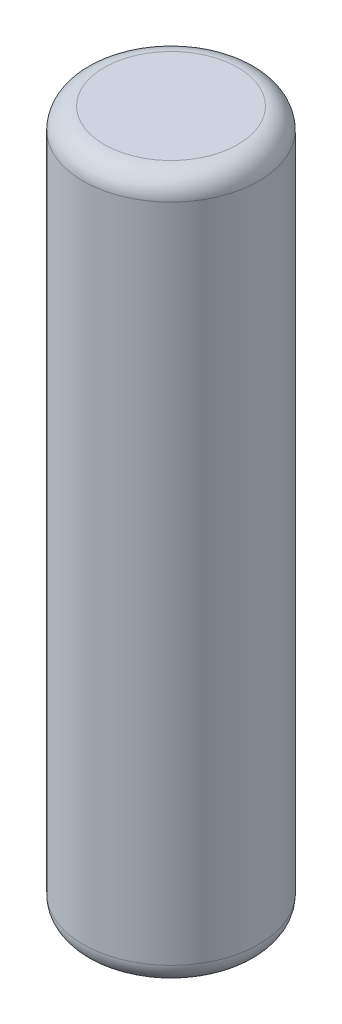
ISO-10303-21;
HEADER;
FILE_DESCRIPTION(('STEP AP214'),'2;1');
FILE_NAME('part.step','',(''),(''),'','','');
FILE_SCHEMA(('AUTOMOTIVE_DESIGN { 1 0 10303 214 1 1 1 1 }'));
ENDSEC;
DATA;
#1=APPLICATION_CONTEXT('core data for automotive mechanical design processes');
#2=APPLICATION_PROTOCOL_DEFINITION('international standard','automotive_design',2000,#1);
#3=PRODUCT_CONTEXT('',#1,'mechanical');
#4=PRODUCT('Part','Part','',(#3));
#5=PRODUCT_RELATED_PRODUCT_CATEGORY('part','',(#4));
#6=PRODUCT_DEFINITION_FORMATION('','',#4);
#7=PRODUCT_DEFINITION_CONTEXT('part definition',#1,'design');
#8=PRODUCT_DEFINITION('design','',#6,#7);
#9=PRODUCT_DEFINITION_SHAPE('','',#8);
#10=(LENGTH_UNIT() NAMED_UNIT(*) SI_UNIT(.MILLI.,.METRE.));
#11=(NAMED_UNIT(*) PLANE_ANGLE_UNIT() SI_UNIT($,.RADIAN.));
#12=(NAMED_UNIT(*) SI_UNIT($,.STERADIAN.) SOLID_ANGLE_UNIT());
#13=UNCERTAINTY_MEASURE_WITH_UNIT(LENGTH_MEASURE(1.E-05),#10,'distance_accuracy_value','');
#14=(GEOMETRIC_REPRESENTATION_CONTEXT(3) GLOBAL_UNCERTAINTY_ASSIGNED_CONTEXT((#13)) GLOBAL_UNIT_ASSIGNED_CONTEXT((#10,
#11,#12)) REPRESENTATION_CONTEXT('',''));
#15=CARTESIAN_POINT('',(0.,0.,0.));
#16=DIRECTION('',(0.,0.,1.));
#17=DIRECTION('',(1.,0.,0.));
#18=AXIS2_PLACEMENT_3D('',#15,#16,#17);
#19=CARTESIAN_POINT('',(0.,10.,0.));
#20=DIRECTION('',(0.,-1.,0.));
#21=DIRECTION('',(0.,0.,-1.));
#22=AXIS2_PLACEMENT_3D('',#19,#20,#21);
#23=CYLINDRICAL_SURFACE('',#22,1.25);
#24=CARTESIAN_POINT('',(0.,0.3,0.));
#25=DIRECTION('',(0.,1.,0.));
#26=DIRECTION('',(0.,0.,1.));
#27=AXIS2_PLACEMENT_3D('',#24,#25,#26);
#28=CIRCLE('',#27,1.25);
#29=CARTESIAN_POINT('',(0.,0.3,1.25));
#30=VERTEX_POINT('',#29);
#31=EDGE_CURVE('E42',#30,#30,#28,.T.);
#32=ORIENTED_EDGE('',*,*,#31,.T.);
#33=EDGE_LOOP('',(#32));
#34=FACE_BOUND('',#33,.T.);
#35=CARTESIAN_POINT('',(0.,9.7,0.));
#36=DIRECTION('',(0.,1.,0.));
#37=DIRECTION('',(0.,0.,1.));
#38=AXIS2_PLACEMENT_3D('',#35,#36,#37);
#39=CIRCLE('',#38,1.25);
#40=CARTESIAN_POINT('',(0.,9.7,1.25));
#41=VERTEX_POINT('',#40);
#42=EDGE_CURVE('E46',#41,#41,#39,.F.);
#43=ORIENTED_EDGE('',*,*,#42,.T.);
#44=EDGE_LOOP('',(#43));
#45=FACE_BOUND('',#44,.T.);
#46=ADVANCED_FACE('F31',(#34,#45),#23,.T.);
#47=CARTESIAN_POINT('',(0.,10.,0.));
#48=DIRECTION('',(0.,1.,0.));
#49=DIRECTION('',(0.,0.,1.));
#50=AXIS2_PLACEMENT_3D('',#47,#48,#49);
#51=PLANE('',#50);
#52=CARTESIAN_POINT('',(0.,10.,0.));
#53=DIRECTION('',(0.,1.,0.));
#54=DIRECTION('',(0.,0.,1.));
#55=AXIS2_PLACEMENT_3D('',#52,#53,#54);
#56=CIRCLE('',#55,0.95);
#57=CARTESIAN_POINT('',(0.,10.,0.95));
#58=VERTEX_POINT('',#57);
#59=EDGE_CURVE('E10',#58,#58,#56,.T.);
#60=ORIENTED_EDGE('',*,*,#59,.T.);
#61=EDGE_LOOP('',(#60));
#62=FACE_BOUND('',#61,.T.);
#63=ADVANCED_FACE('F62',(#62),#51,.T.);
#64=CARTESIAN_POINT('',(0.,0.,0.));
#65=DIRECTION('',(0.,1.,0.));
#66=DIRECTION('',(0.,0.,1.));
#67=AXIS2_PLACEMENT_3D('',#64,#65,#66);
#68=PLANE('',#67);
#69=CARTESIAN_POINT('',(0.,0.,0.));
#70=DIRECTION('',(0.,1.,0.));
#71=DIRECTION('',(0.,0.,1.));
#72=AXIS2_PLACEMENT_3D('',#69,#70,#71);
#73=CIRCLE('',#72,0.95);
#74=CARTESIAN_POINT('',(0.,0.,0.95));
#75=VERTEX_POINT('',#74);
#76=EDGE_CURVE('E38',#75,#75,#73,.F.);
#77=ORIENTED_EDGE('',*,*,#76,.T.);
#78=EDGE_LOOP('',(#77));
#79=FACE_BOUND('',#78,.T.);
#80=ADVANCED_FACE('F59',(#79),#68,.F.);
#81=CARTESIAN_POINT('',(0.,0.3,0.));
#82=DIRECTION('',(0.,1.,0.));
#83=DIRECTION('',(0.,0.,1.));
#84=AXIS2_PLACEMENT_3D('',#81,#82,#83);
#85=TOROIDAL_SURFACE('',#84,0.95,0.3);
#86=ORIENTED_EDGE('',*,*,#76,.F.);
#87=EDGE_LOOP('',(#86));
#88=FACE_BOUND('',#87,.T.);
#89=ORIENTED_EDGE('',*,*,#31,.F.);
#90=EDGE_LOOP('',(#89));
#91=FACE_BOUND('',#90,.T.);
#92=ADVANCED_FACE('F55',(#88,#91),#85,.T.);
#93=CARTESIAN_POINT('',(0.,9.7,0.));
#94=DIRECTION('',(0.,1.,0.));
#95=DIRECTION('',(0.,0.,1.));
#96=AXIS2_PLACEMENT_3D('',#93,#94,#95);
#97=TOROIDAL_SURFACE('',#96,0.95,0.3);
#98=ORIENTED_EDGE('',*,*,#42,.F.);
#99=EDGE_LOOP('',(#98));
#100=FACE_BOUND('',#99,.T.);
#101=ORIENTED_EDGE('',*,*,#59,.F.);
#102=EDGE_LOOP('',(#101));
#103=FACE_BOUND('',#102,.T.);
#104=ADVANCED_FACE('F33',(#100,#103),#97,.T.);
#105=CLOSED_SHELL('',(#46,#63,#80,#92,#104));
#106=MANIFOLD_SOLID_BREP('B2',#105);
#107=ADVANCED_BREP_SHAPE_REPRESENTATION('',(#18,#106),#14);
#108=SHAPE_DEFINITION_REPRESENTATION(#9,#107);
ENDSEC;
END-ISO-10303-21;
